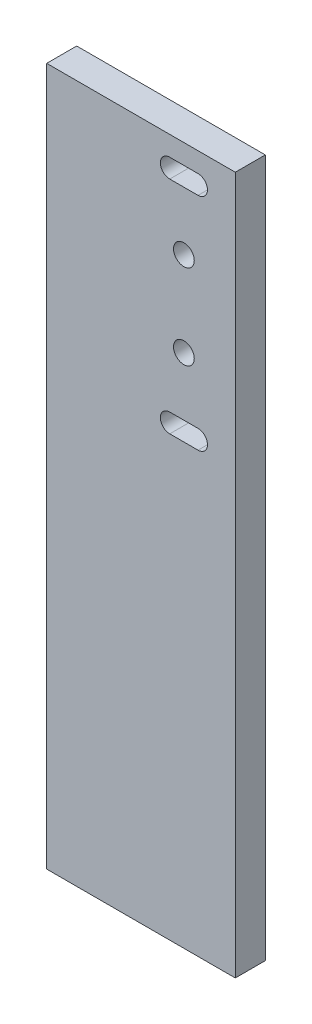
ISO-10303-21;
HEADER;
FILE_DESCRIPTION(('STEP AP214'),'2;1');
FILE_NAME('part.step','',(''),(''),'','','');
FILE_SCHEMA(('AUTOMOTIVE_DESIGN { 1 0 10303 214 1 1 1 1 }'));
ENDSEC;
DATA;
#1=APPLICATION_CONTEXT('core data for automotive mechanical design processes');
#2=APPLICATION_PROTOCOL_DEFINITION('international standard','automotive_design',2000,#1);
#3=PRODUCT_CONTEXT('',#1,'mechanical');
#4=PRODUCT('Part','Part','',(#3));
#5=PRODUCT_RELATED_PRODUCT_CATEGORY('part','',(#4));
#6=PRODUCT_DEFINITION_FORMATION('','',#4);
#7=PRODUCT_DEFINITION_CONTEXT('part definition',#1,'design');
#8=PRODUCT_DEFINITION('design','',#6,#7);
#9=PRODUCT_DEFINITION_SHAPE('','',#8);
#10=(LENGTH_UNIT() NAMED_UNIT(*) SI_UNIT(.MILLI.,.METRE.));
#11=(NAMED_UNIT(*) PLANE_ANGLE_UNIT() SI_UNIT($,.RADIAN.));
#12=(NAMED_UNIT(*) SI_UNIT($,.STERADIAN.) SOLID_ANGLE_UNIT());
#13=UNCERTAINTY_MEASURE_WITH_UNIT(LENGTH_MEASURE(1.E-05),#10,'distance_accuracy_value','');
#14=(GEOMETRIC_REPRESENTATION_CONTEXT(3) GLOBAL_UNCERTAINTY_ASSIGNED_CONTEXT((#13)) GLOBAL_UNIT_ASSIGNED_CONTEXT((#10,
#11,#12)) REPRESENTATION_CONTEXT('',''));
#15=CARTESIAN_POINT('',(0.,0.,0.));
#16=DIRECTION('',(0.,0.,1.));
#17=DIRECTION('',(1.,0.,0.));
#18=AXIS2_PLACEMENT_3D('',#15,#16,#17);
#19=CARTESIAN_POINT('',(0.,0.,-1.59143954));
#20=DIRECTION('',(0.,1.,0.));
#21=DIRECTION('',(1.,0.,0.));
#22=AXIS2_PLACEMENT_3D('',#19,#20,#21);
#23=PLANE('',#22);
#24=DIRECTION('',(1.,0.,0.));
#25=VECTOR('',#24,1.);
#26=CARTESIAN_POINT('',(0.,0.,-1.59143954));
#27=LINE('',#26,#25);
#28=CARTESIAN_POINT('',(0.,0.,-1.59143954));
#29=VERTEX_POINT('',#28);
#30=CARTESIAN_POINT('',(10.,0.,-1.59143954));
#31=VERTEX_POINT('',#30);
#32=EDGE_CURVE('E11',#29,#31,#27,.T.);
#33=ORIENTED_EDGE('',*,*,#32,.T.);
#34=DIRECTION('',(0.,0.,1.));
#35=VECTOR('',#34,1.);
#36=CARTESIAN_POINT('',(10.,0.,-1.59143954));
#37=LINE('',#36,#35);
#38=CARTESIAN_POINT('',(10.,0.,0.));
#39=VERTEX_POINT('',#38);
#40=EDGE_CURVE('E24',#31,#39,#37,.T.);
#41=ORIENTED_EDGE('',*,*,#40,.T.);
#42=DIRECTION('',(1.,0.,0.));
#43=VECTOR('',#42,1.);
#44=CARTESIAN_POINT('',(0.,0.,0.));
#45=LINE('',#44,#43);
#46=CARTESIAN_POINT('',(0.,0.,0.));
#47=VERTEX_POINT('',#46);
#48=EDGE_CURVE('E218',#47,#39,#45,.T.);
#49=ORIENTED_EDGE('',*,*,#48,.F.);
#50=DIRECTION('',(0.,0.,1.));
#51=VECTOR('',#50,1.);
#52=CARTESIAN_POINT('',(0.,0.,-1.59143954));
#53=LINE('',#52,#51);
#54=EDGE_CURVE('E36',#29,#47,#53,.T.);
#55=ORIENTED_EDGE('',*,*,#54,.F.);
#56=EDGE_LOOP('',(#33,#41,#49,#55));
#57=FACE_BOUND('',#56,.T.);
#58=ADVANCED_FACE('F17',(#57),#23,.F.);
#59=CARTESIAN_POINT('',(10.,0.,-1.59143954));
#60=DIRECTION('',(-1.,0.,0.));
#61=DIRECTION('',(0.,1.,0.));
#62=AXIS2_PLACEMENT_3D('',#59,#60,#61);
#63=PLANE('',#62);
#64=DIRECTION('',(0.,1.,0.));
#65=VECTOR('',#64,1.);
#66=CARTESIAN_POINT('',(10.,0.,-1.59143954));
#67=LINE('',#66,#65);
#68=CARTESIAN_POINT('',(10.,37.,-1.59143954));
#69=VERTEX_POINT('',#68);
#70=EDGE_CURVE('E215',#31,#69,#67,.T.);
#71=ORIENTED_EDGE('',*,*,#70,.T.);
#72=DIRECTION('',(0.,0.,1.));
#73=VECTOR('',#72,1.);
#74=CARTESIAN_POINT('',(10.,37.,-1.59143954));
#75=LINE('',#74,#73);
#76=CARTESIAN_POINT('',(10.,37.,0.));
#77=VERTEX_POINT('',#76);
#78=EDGE_CURVE('E212',#69,#77,#75,.T.);
#79=ORIENTED_EDGE('',*,*,#78,.T.);
#80=DIRECTION('',(0.,1.,0.));
#81=VECTOR('',#80,1.);
#82=CARTESIAN_POINT('',(10.,0.,0.));
#83=LINE('',#82,#81);
#84=EDGE_CURVE('E210',#39,#77,#83,.T.);
#85=ORIENTED_EDGE('',*,*,#84,.F.);
#86=ORIENTED_EDGE('',*,*,#40,.F.);
#87=EDGE_LOOP('',(#71,#79,#85,#86));
#88=FACE_BOUND('',#87,.T.);
#89=ADVANCED_FACE('F220',(#88),#63,.F.);
#90=CARTESIAN_POINT('',(10.,37.,-1.59143954));
#91=DIRECTION('',(0.,-1.,0.));
#92=DIRECTION('',(-1.,0.,0.));
#93=AXIS2_PLACEMENT_3D('',#90,#91,#92);
#94=PLANE('',#93);
#95=DIRECTION('',(-1.,0.,0.));
#96=VECTOR('',#95,1.);
#97=CARTESIAN_POINT('',(10.,37.,-1.59143954));
#98=LINE('',#97,#96);
#99=CARTESIAN_POINT('',(0.,37.,-1.59143954));
#100=VERTEX_POINT('',#99);
#101=EDGE_CURVE('E207',#69,#100,#98,.T.);
#102=ORIENTED_EDGE('',*,*,#101,.T.);
#103=DIRECTION('',(0.,0.,1.));
#104=VECTOR('',#103,1.);
#105=CARTESIAN_POINT('',(0.,37.,-1.59143954));
#106=LINE('',#105,#104);
#107=CARTESIAN_POINT('',(0.,37.,0.));
#108=VERTEX_POINT('',#107);
#109=EDGE_CURVE('E204',#100,#108,#106,.T.);
#110=ORIENTED_EDGE('',*,*,#109,.T.);
#111=DIRECTION('',(-1.,0.,0.));
#112=VECTOR('',#111,1.);
#113=CARTESIAN_POINT('',(10.,37.,0.));
#114=LINE('',#113,#112);
#115=EDGE_CURVE('E202',#77,#108,#114,.T.);
#116=ORIENTED_EDGE('',*,*,#115,.F.);
#117=ORIENTED_EDGE('',*,*,#78,.F.);
#118=EDGE_LOOP('',(#102,#110,#116,#117));
#119=FACE_BOUND('',#118,.T.);
#120=ADVANCED_FACE('F233',(#119),#94,.F.);
#121=CARTESIAN_POINT('',(0.,37.,-1.59143954));
#122=DIRECTION('',(1.,0.,0.));
#123=DIRECTION('',(0.,-1.,0.));
#124=AXIS2_PLACEMENT_3D('',#121,#122,#123);
#125=PLANE('',#124);
#126=DIRECTION('',(0.,-1.,0.));
#127=VECTOR('',#126,1.);
#128=CARTESIAN_POINT('',(0.,37.,-1.59143954));
#129=LINE('',#128,#127);
#130=EDGE_CURVE('E199',#100,#29,#129,.T.);
#131=ORIENTED_EDGE('',*,*,#130,.T.);
#132=ORIENTED_EDGE('',*,*,#54,.T.);
#133=DIRECTION('',(0.,-1.,0.));
#134=VECTOR('',#133,1.);
#135=CARTESIAN_POINT('',(0.,37.,0.));
#136=LINE('',#135,#134);
#137=EDGE_CURVE('E196',#108,#47,#136,.T.);
#138=ORIENTED_EDGE('',*,*,#137,.F.);
#139=ORIENTED_EDGE('',*,*,#109,.F.);
#140=EDGE_LOOP('',(#131,#132,#138,#139));
#141=FACE_BOUND('',#140,.T.);
#142=ADVANCED_FACE('F227',(#141),#125,.F.);
#143=CARTESIAN_POINT('',(8.02499792,24.2500023,-1.59143954));
#144=DIRECTION('',(0.,-1.,0.));
#145=DIRECTION('',(-1.,0.,0.));
#146=AXIS2_PLACEMENT_3D('',#143,#144,#145);
#147=PLANE('',#146);
#148=DIRECTION('',(0.,0.,1.));
#149=VECTOR('',#148,1.);
#150=CARTESIAN_POINT('',(8.02499792,24.2500023,-1.59143954));
#151=LINE('',#150,#149);
#152=CARTESIAN_POINT('',(8.02499792,24.2500023,-1.59143954));
#153=VERTEX_POINT('',#152);
#154=CARTESIAN_POINT('',(8.02499792,24.2500023,0.));
#155=VERTEX_POINT('',#154);
#156=EDGE_CURVE('E194',#153,#155,#151,.T.);
#157=ORIENTED_EDGE('',*,*,#156,.T.);
#158=DIRECTION('',(-1.,0.,0.));
#159=VECTOR('',#158,1.);
#160=CARTESIAN_POINT('',(8.02499792,24.2500023,0.));
#161=LINE('',#160,#159);
#162=CARTESIAN_POINT('',(6.52499584,24.2500023,0.));
#163=VERTEX_POINT('',#162);
#164=EDGE_CURVE('E192',#155,#163,#161,.T.);
#165=ORIENTED_EDGE('',*,*,#164,.T.);
#166=DIRECTION('',(0.,0.,1.));
#167=VECTOR('',#166,1.);
#168=CARTESIAN_POINT('',(6.52499584,24.2500023,-1.59143954));
#169=LINE('',#168,#167);
#170=CARTESIAN_POINT('',(6.52499584,24.2500023,-1.59143954));
#171=VERTEX_POINT('',#170);
#172=EDGE_CURVE('E189',#171,#163,#169,.T.);
#173=ORIENTED_EDGE('',*,*,#172,.F.);
#174=DIRECTION('',(-1.,0.,0.));
#175=VECTOR('',#174,1.);
#176=CARTESIAN_POINT('',(8.02499792,24.2500023,-1.59143954));
#177=LINE('',#176,#175);
#178=EDGE_CURVE('E186',#153,#171,#177,.T.);
#179=ORIENTED_EDGE('',*,*,#178,.F.);
#180=EDGE_LOOP('',(#157,#165,#173,#179));
#181=FACE_BOUND('',#180,.T.);
#182=ADVANCED_FACE('F241',(#181),#147,.T.);
#183=CARTESIAN_POINT('',(6.52499584,23.7500033,-1.59143954));
#184=DIRECTION('',(0.,0.,-1.));
#185=DIRECTION('',(0.,1.,0.));
#186=AXIS2_PLACEMENT_3D('',#183,#184,#185);
#187=CYLINDRICAL_SURFACE('',#186,0.499999);
#188=ORIENTED_EDGE('',*,*,#172,.T.);
#189=CARTESIAN_POINT('',(6.52499584,23.7500033,0.));
#190=DIRECTION('',(0.,0.,1.));
#191=DIRECTION('',(0.,1.,0.));
#192=AXIS2_PLACEMENT_3D('',#189,#190,#191);
#193=CIRCLE('',#192,0.499999);
#194=CARTESIAN_POINT('',(6.52499584,23.2500043,0.));
#195=VERTEX_POINT('',#194);
#196=EDGE_CURVE('E183',#163,#195,#193,.T.);
#197=ORIENTED_EDGE('',*,*,#196,.T.);
#198=DIRECTION('',(0.,0.,1.));
#199=VECTOR('',#198,1.);
#200=CARTESIAN_POINT('',(6.52499584,23.2500043,-1.59143954));
#201=LINE('',#200,#199);
#202=CARTESIAN_POINT('',(6.52499584,23.2500043,-1.59143954));
#203=VERTEX_POINT('',#202);
#204=EDGE_CURVE('E181',#203,#195,#201,.T.);
#205=ORIENTED_EDGE('',*,*,#204,.F.);
#206=CARTESIAN_POINT('',(6.52499584,23.7500033,-1.59143954));
#207=DIRECTION('',(0.,0.,1.));
#208=DIRECTION('',(0.,1.,0.));
#209=AXIS2_PLACEMENT_3D('',#206,#207,#208);
#210=CIRCLE('',#209,0.499999);
#211=EDGE_CURVE('E179',#171,#203,#210,.T.);
#212=ORIENTED_EDGE('',*,*,#211,.F.);
#213=EDGE_LOOP('',(#188,#197,#205,#212));
#214=FACE_BOUND('',#213,.T.);
#215=ADVANCED_FACE('F277',(#214),#187,.F.);
#216=CARTESIAN_POINT('',(6.52499584,23.2500043,-1.59143954));
#217=DIRECTION('',(0.,1.,0.));
#218=DIRECTION('',(1.,0.,0.));
#219=AXIS2_PLACEMENT_3D('',#216,#217,#218);
#220=PLANE('',#219);
#221=ORIENTED_EDGE('',*,*,#204,.T.);
#222=DIRECTION('',(1.,0.,0.));
#223=VECTOR('',#222,1.);
#224=CARTESIAN_POINT('',(6.52499584,23.2500043,0.));
#225=LINE('',#224,#223);
#226=CARTESIAN_POINT('',(8.02499792,23.2500043,0.));
#227=VERTEX_POINT('',#226);
#228=EDGE_CURVE('E177',#195,#227,#225,.T.);
#229=ORIENTED_EDGE('',*,*,#228,.T.);
#230=DIRECTION('',(0.,0.,1.));
#231=VECTOR('',#230,1.);
#232=CARTESIAN_POINT('',(8.02499792,23.2500043,-1.59143954));
#233=LINE('',#232,#231);
#234=CARTESIAN_POINT('',(8.02499792,23.2500043,-1.59143954));
#235=VERTEX_POINT('',#234);
#236=EDGE_CURVE('E174',#235,#227,#233,.T.);
#237=ORIENTED_EDGE('',*,*,#236,.F.);
#238=DIRECTION('',(1.,0.,0.));
#239=VECTOR('',#238,1.);
#240=CARTESIAN_POINT('',(6.52499584,23.2500043,-1.59143954));
#241=LINE('',#240,#239);
#242=EDGE_CURVE('E171',#203,#235,#241,.T.);
#243=ORIENTED_EDGE('',*,*,#242,.F.);
#244=EDGE_LOOP('',(#221,#229,#237,#243));
#245=FACE_BOUND('',#244,.T.);
#246=ADVANCED_FACE('F287',(#245),#220,.T.);
#247=CARTESIAN_POINT('',(8.02499792,23.7500033,-1.59143954));
#248=DIRECTION('',(0.,0.,-1.));
#249=DIRECTION('',(0.,-1.,0.));
#250=AXIS2_PLACEMENT_3D('',#247,#248,#249);
#251=CYLINDRICAL_SURFACE('',#250,0.499999);
#252=ORIENTED_EDGE('',*,*,#236,.T.);
#253=CARTESIAN_POINT('',(8.02499792,23.7500033,0.));
#254=DIRECTION('',(0.,0.,1.));
#255=DIRECTION('',(0.,-1.,0.));
#256=AXIS2_PLACEMENT_3D('',#253,#254,#255);
#257=CIRCLE('',#256,0.499999);
#258=EDGE_CURVE('E168',#227,#155,#257,.T.);
#259=ORIENTED_EDGE('',*,*,#258,.T.);
#260=ORIENTED_EDGE('',*,*,#156,.F.);
#261=CARTESIAN_POINT('',(8.02499792,23.7500033,-1.59143954));
#262=DIRECTION('',(0.,0.,1.));
#263=DIRECTION('',(0.,-1.,0.));
#264=AXIS2_PLACEMENT_3D('',#261,#262,#263);
#265=CIRCLE('',#264,0.499999);
#266=EDGE_CURVE('E165',#235,#153,#265,.T.);
#267=ORIENTED_EDGE('',*,*,#266,.F.);
#268=EDGE_LOOP('',(#252,#259,#260,#267));
#269=FACE_BOUND('',#268,.T.);
#270=ADVANCED_FACE('F297',(#269),#251,.F.);
#271=CARTESIAN_POINT('',(8.02499792,35.9500043,-1.59143954));
#272=DIRECTION('',(0.,-1.,0.));
#273=DIRECTION('',(-1.,0.,0.));
#274=AXIS2_PLACEMENT_3D('',#271,#272,#273);
#275=PLANE('',#274);
#276=DIRECTION('',(0.,0.,1.));
#277=VECTOR('',#276,1.);
#278=CARTESIAN_POINT('',(8.02499792,35.9500043,-1.59143954));
#279=LINE('',#278,#277);
#280=CARTESIAN_POINT('',(8.02499792,35.9500043,-1.59143954));
#281=VERTEX_POINT('',#280);
#282=CARTESIAN_POINT('',(8.02499792,35.9500043,0.));
#283=VERTEX_POINT('',#282);
#284=EDGE_CURVE('E163',#281,#283,#279,.T.);
#285=ORIENTED_EDGE('',*,*,#284,.T.);
#286=DIRECTION('',(-1.,0.,0.));
#287=VECTOR('',#286,1.);
#288=CARTESIAN_POINT('',(8.02499792,35.9500043,0.));
#289=LINE('',#288,#287);
#290=CARTESIAN_POINT('',(6.52499584,35.9500043,0.));
#291=VERTEX_POINT('',#290);
#292=EDGE_CURVE('E161',#283,#291,#289,.T.);
#293=ORIENTED_EDGE('',*,*,#292,.T.);
#294=DIRECTION('',(0.,0.,1.));
#295=VECTOR('',#294,1.);
#296=CARTESIAN_POINT('',(6.52499584,35.9500043,-1.59143954));
#297=LINE('',#296,#295);
#298=CARTESIAN_POINT('',(6.52499584,35.9500043,-1.59143954));
#299=VERTEX_POINT('',#298);
#300=EDGE_CURVE('E158',#299,#291,#297,.T.);
#301=ORIENTED_EDGE('',*,*,#300,.F.);
#302=DIRECTION('',(-1.,0.,0.));
#303=VECTOR('',#302,1.);
#304=CARTESIAN_POINT('',(8.02499792,35.9500043,-1.59143954));
#305=LINE('',#304,#303);
#306=EDGE_CURVE('E155',#281,#299,#305,.T.);
#307=ORIENTED_EDGE('',*,*,#306,.F.);
#308=EDGE_LOOP('',(#285,#293,#301,#307));
#309=FACE_BOUND('',#308,.T.);
#310=ADVANCED_FACE('F307',(#309),#275,.T.);
#311=CARTESIAN_POINT('',(6.52499584,35.4500053,-1.59143954));
#312=DIRECTION('',(0.,0.,-1.));
#313=DIRECTION('',(0.,1.,0.));
#314=AXIS2_PLACEMENT_3D('',#311,#312,#313);
#315=CYLINDRICAL_SURFACE('',#314,0.499999);
#316=ORIENTED_EDGE('',*,*,#300,.T.);
#317=CARTESIAN_POINT('',(6.52499584,35.4500053,0.));
#318=DIRECTION('',(0.,0.,1.));
#319=DIRECTION('',(0.,1.,0.));
#320=AXIS2_PLACEMENT_3D('',#317,#318,#319);
#321=CIRCLE('',#320,0.499999);
#322=CARTESIAN_POINT('',(6.52499584,34.9500063,0.));
#323=VERTEX_POINT('',#322);
#324=EDGE_CURVE('E152',#291,#323,#321,.T.);
#325=ORIENTED_EDGE('',*,*,#324,.T.);
#326=DIRECTION('',(0.,0.,1.));
#327=VECTOR('',#326,1.);
#328=CARTESIAN_POINT('',(6.52499584,34.9500063,-1.59143954));
#329=LINE('',#328,#327);
#330=CARTESIAN_POINT('',(6.52499584,34.9500063,-1.59143954));
#331=VERTEX_POINT('',#330);
#332=EDGE_CURVE('E150',#331,#323,#329,.T.);
#333=ORIENTED_EDGE('',*,*,#332,.F.);
#334=CARTESIAN_POINT('',(6.52499584,35.4500053,-1.59143954));
#335=DIRECTION('',(0.,0.,1.));
#336=DIRECTION('',(0.,1.,0.));
#337=AXIS2_PLACEMENT_3D('',#334,#335,#336);
#338=CIRCLE('',#337,0.499999);
#339=EDGE_CURVE('E148',#299,#331,#338,.T.);
#340=ORIENTED_EDGE('',*,*,#339,.F.);
#341=EDGE_LOOP('',(#316,#325,#333,#340));
#342=FACE_BOUND('',#341,.T.);
#343=ADVANCED_FACE('F317',(#342),#315,.F.);
#344=CARTESIAN_POINT('',(6.52499584,34.9500063,-1.59143954));
#345=DIRECTION('',(0.,1.,0.));
#346=DIRECTION('',(1.,0.,0.));
#347=AXIS2_PLACEMENT_3D('',#344,#345,#346);
#348=PLANE('',#347);
#349=ORIENTED_EDGE('',*,*,#332,.T.);
#350=DIRECTION('',(1.,0.,0.));
#351=VECTOR('',#350,1.);
#352=CARTESIAN_POINT('',(6.52499584,34.9500063,0.));
#353=LINE('',#352,#351);
#354=CARTESIAN_POINT('',(8.02499792,34.9500063,0.));
#355=VERTEX_POINT('',#354);
#356=EDGE_CURVE('E146',#323,#355,#353,.T.);
#357=ORIENTED_EDGE('',*,*,#356,.T.);
#358=DIRECTION('',(0.,0.,1.));
#359=VECTOR('',#358,1.);
#360=CARTESIAN_POINT('',(8.02499792,34.9500063,-1.59143954));
#361=LINE('',#360,#359);
#362=CARTESIAN_POINT('',(8.02499792,34.9500063,-1.59143954));
#363=VERTEX_POINT('',#362);
#364=EDGE_CURVE('E143',#363,#355,#361,.T.);
#365=ORIENTED_EDGE('',*,*,#364,.F.);
#366=DIRECTION('',(1.,0.,0.));
#367=VECTOR('',#366,1.);
#368=CARTESIAN_POINT('',(6.52499584,34.9500063,-1.59143954));
#369=LINE('',#368,#367);
#370=EDGE_CURVE('E140',#331,#363,#369,.T.);
#371=ORIENTED_EDGE('',*,*,#370,.F.);
#372=EDGE_LOOP('',(#349,#357,#365,#371));
#373=FACE_BOUND('',#372,.T.);
#374=ADVANCED_FACE('F327',(#373),#348,.T.);
#375=CARTESIAN_POINT('',(8.02499792,35.4500053,-1.59143954));
#376=DIRECTION('',(0.,0.,-1.));
#377=DIRECTION('',(0.,-1.,0.));
#378=AXIS2_PLACEMENT_3D('',#375,#376,#377);
#379=CYLINDRICAL_SURFACE('',#378,0.499999);
#380=ORIENTED_EDGE('',*,*,#364,.T.);
#381=CARTESIAN_POINT('',(8.02499792,35.4500053,0.));
#382=DIRECTION('',(0.,0.,1.));
#383=DIRECTION('',(0.,-1.,0.));
#384=AXIS2_PLACEMENT_3D('',#381,#382,#383);
#385=CIRCLE('',#384,0.499999);
#386=EDGE_CURVE('E137',#355,#283,#385,.T.);
#387=ORIENTED_EDGE('',*,*,#386,.T.);
#388=ORIENTED_EDGE('',*,*,#284,.F.);
#389=CARTESIAN_POINT('',(8.02499792,35.4500053,-1.59143954));
#390=DIRECTION('',(0.,0.,1.));
#391=DIRECTION('',(0.,-1.,0.));
#392=AXIS2_PLACEMENT_3D('',#389,#390,#391);
#393=CIRCLE('',#392,0.499999);
#394=EDGE_CURVE('E134',#363,#281,#393,.T.);
#395=ORIENTED_EDGE('',*,*,#394,.F.);
#396=EDGE_LOOP('',(#380,#387,#388,#395));
#397=FACE_BOUND('',#396,.T.);
#398=ADVANCED_FACE('F337',(#397),#379,.F.);
#399=CARTESIAN_POINT('',(7.27499688,27.35000372,-1.59143954));
#400=DIRECTION('',(0.,0.,-1.));
#401=DIRECTION('',(1.,0.,0.));
#402=AXIS2_PLACEMENT_3D('',#399,#400,#401);
#403=CYLINDRICAL_SURFACE('',#402,0.5499989);
#404=DIRECTION('',(0.,0.,1.));
#405=VECTOR('',#404,1.);
#406=CARTESIAN_POINT('',(7.82499578,27.35000372,-1.59143954));
#407=LINE('',#406,#405);
#408=CARTESIAN_POINT('',(7.82499578,27.35000372,-1.59143954));
#409=VERTEX_POINT('',#408);
#410=CARTESIAN_POINT('',(7.82499578,27.35000372,0.));
#411=VERTEX_POINT('',#410);
#412=EDGE_CURVE('E132',#409,#411,#407,.T.);
#413=ORIENTED_EDGE('',*,*,#412,.T.);
#414=CARTESIAN_POINT('',(7.27499688,27.35000372,0.));
#415=DIRECTION('',(0.,0.,1.));
#416=DIRECTION('',(1.,0.,0.));
#417=AXIS2_PLACEMENT_3D('',#414,#415,#416);
#418=CIRCLE('',#417,0.5499989);
#419=EDGE_CURVE('E129',#411,#411,#418,.T.);
#420=ORIENTED_EDGE('',*,*,#419,.T.);
#421=ORIENTED_EDGE('',*,*,#412,.F.);
#422=CARTESIAN_POINT('',(7.27499688,27.35000372,-1.59143954));
#423=DIRECTION('',(0.,0.,1.));
#424=DIRECTION('',(1.,0.,0.));
#425=AXIS2_PLACEMENT_3D('',#422,#423,#424);
#426=CIRCLE('',#425,0.5499989);
#427=EDGE_CURVE('E127',#409,#409,#426,.T.);
#428=ORIENTED_EDGE('',*,*,#427,.F.);
#429=EDGE_LOOP('',(#413,#420,#421,#428));
#430=FACE_BOUND('',#429,.T.);
#431=ADVANCED_FACE('F347',(#430),#403,.F.);
#432=CARTESIAN_POINT('',(7.27499688,31.85000488,-1.59143954));
#433=DIRECTION('',(0.,0.,-1.));
#434=DIRECTION('',(1.,0.,0.));
#435=AXIS2_PLACEMENT_3D('',#432,#433,#434);
#436=CYLINDRICAL_SURFACE('',#435,0.5499989);
#437=DIRECTION('',(0.,0.,1.));
#438=VECTOR('',#437,1.);
#439=CARTESIAN_POINT('',(7.82499578,31.85000488,-1.59143954));
#440=LINE('',#439,#438);
#441=CARTESIAN_POINT('',(7.82499578,31.85000488,-1.59143954));
#442=VERTEX_POINT('',#441);
#443=CARTESIAN_POINT('',(7.82499578,31.85000488,0.));
#444=VERTEX_POINT('',#443);
#445=EDGE_CURVE('E123',#442,#444,#440,.T.);
#446=ORIENTED_EDGE('',*,*,#445,.T.);
#447=CARTESIAN_POINT('',(7.27499688,31.85000488,0.));
#448=DIRECTION('',(0.,0.,1.));
#449=DIRECTION('',(1.,0.,0.));
#450=AXIS2_PLACEMENT_3D('',#447,#448,#449);
#451=CIRCLE('',#450,0.5499989);
#452=EDGE_CURVE('E120',#444,#444,#451,.T.);
#453=ORIENTED_EDGE('',*,*,#452,.T.);
#454=ORIENTED_EDGE('',*,*,#445,.F.);
#455=CARTESIAN_POINT('',(7.27499688,31.85000488,-1.59143954));
#456=DIRECTION('',(0.,0.,1.));
#457=DIRECTION('',(1.,0.,0.));
#458=AXIS2_PLACEMENT_3D('',#455,#456,#457);
#459=CIRCLE('',#458,0.5499989);
#460=EDGE_CURVE('E116',#442,#442,#459,.T.);
#461=ORIENTED_EDGE('',*,*,#460,.F.);
#462=EDGE_LOOP('',(#446,#453,#454,#461));
#463=FACE_BOUND('',#462,.T.);
#464=ADVANCED_FACE('F357',(#463),#436,.F.);
#465=CARTESIAN_POINT('',(0.,0.,-1.59143954));
#466=DIRECTION('',(0.,0.,-1.));
#467=DIRECTION('',(-1.,0.,0.));
#468=AXIS2_PLACEMENT_3D('',#465,#466,#467);
#469=PLANE('',#468);
#470=ORIENTED_EDGE('',*,*,#130,.F.);
#471=ORIENTED_EDGE('',*,*,#101,.F.);
#472=ORIENTED_EDGE('',*,*,#70,.F.);
#473=ORIENTED_EDGE('',*,*,#32,.F.);
#474=EDGE_LOOP('',(#470,#471,#472,#473));
#475=FACE_BOUND('',#474,.T.);
#476=ORIENTED_EDGE('',*,*,#178,.T.);
#477=ORIENTED_EDGE('',*,*,#211,.T.);
#478=ORIENTED_EDGE('',*,*,#242,.T.);
#479=ORIENTED_EDGE('',*,*,#266,.T.);
#480=EDGE_LOOP('',(#476,#477,#478,#479));
#481=FACE_BOUND('',#480,.T.);
#482=ORIENTED_EDGE('',*,*,#306,.T.);
#483=ORIENTED_EDGE('',*,*,#339,.T.);
#484=ORIENTED_EDGE('',*,*,#370,.T.);
#485=ORIENTED_EDGE('',*,*,#394,.T.);
#486=EDGE_LOOP('',(#482,#483,#484,#485));
#487=FACE_BOUND('',#486,.T.);
#488=ORIENTED_EDGE('',*,*,#427,.T.);
#489=EDGE_LOOP('',(#488));
#490=FACE_BOUND('',#489,.T.);
#491=ORIENTED_EDGE('',*,*,#460,.T.);
#492=EDGE_LOOP('',(#491));
#493=FACE_BOUND('',#492,.T.);
#494=ADVANCED_FACE('F117',(#475,#481,#487,#490,#493),#469,.T.);
#495=CARTESIAN_POINT('',(0.,0.,0.));
#496=DIRECTION('',(0.,0.,-1.));
#497=DIRECTION('',(-1.,0.,0.));
#498=AXIS2_PLACEMENT_3D('',#495,#496,#497);
#499=PLANE('',#498);
#500=ORIENTED_EDGE('',*,*,#48,.T.);
#501=ORIENTED_EDGE('',*,*,#84,.T.);
#502=ORIENTED_EDGE('',*,*,#115,.T.);
#503=ORIENTED_EDGE('',*,*,#137,.T.);
#504=EDGE_LOOP('',(#500,#501,#502,#503));
#505=FACE_BOUND('',#504,.T.);
#506=ORIENTED_EDGE('',*,*,#258,.F.);
#507=ORIENTED_EDGE('',*,*,#228,.F.);
#508=ORIENTED_EDGE('',*,*,#196,.F.);
#509=ORIENTED_EDGE('',*,*,#164,.F.);
#510=EDGE_LOOP('',(#506,#507,#508,#509));
#511=FACE_BOUND('',#510,.T.);
#512=ORIENTED_EDGE('',*,*,#386,.F.);
#513=ORIENTED_EDGE('',*,*,#356,.F.);
#514=ORIENTED_EDGE('',*,*,#324,.F.);
#515=ORIENTED_EDGE('',*,*,#292,.F.);
#516=EDGE_LOOP('',(#512,#513,#514,#515));
#517=FACE_BOUND('',#516,.T.);
#518=ORIENTED_EDGE('',*,*,#419,.F.);
#519=EDGE_LOOP('',(#518));
#520=FACE_BOUND('',#519,.T.);
#521=ORIENTED_EDGE('',*,*,#452,.F.);
#522=EDGE_LOOP('',(#521));
#523=FACE_BOUND('',#522,.T.);
#524=ADVANCED_FACE('F223',(#505,#511,#517,#520,#523),#499,.F.);
#525=CLOSED_SHELL('',(#58,#89,#120,#142,#182,#215,#246,#270,#310,#343,#374,#398,#431,#464,#494,#524));
#526=MANIFOLD_SOLID_BREP('B1',#525);
#527=ADVANCED_BREP_SHAPE_REPRESENTATION('',(#18,#526),#14);
#528=SHAPE_DEFINITION_REPRESENTATION(#9,#527);
ENDSEC;
END-ISO-10303-21;
